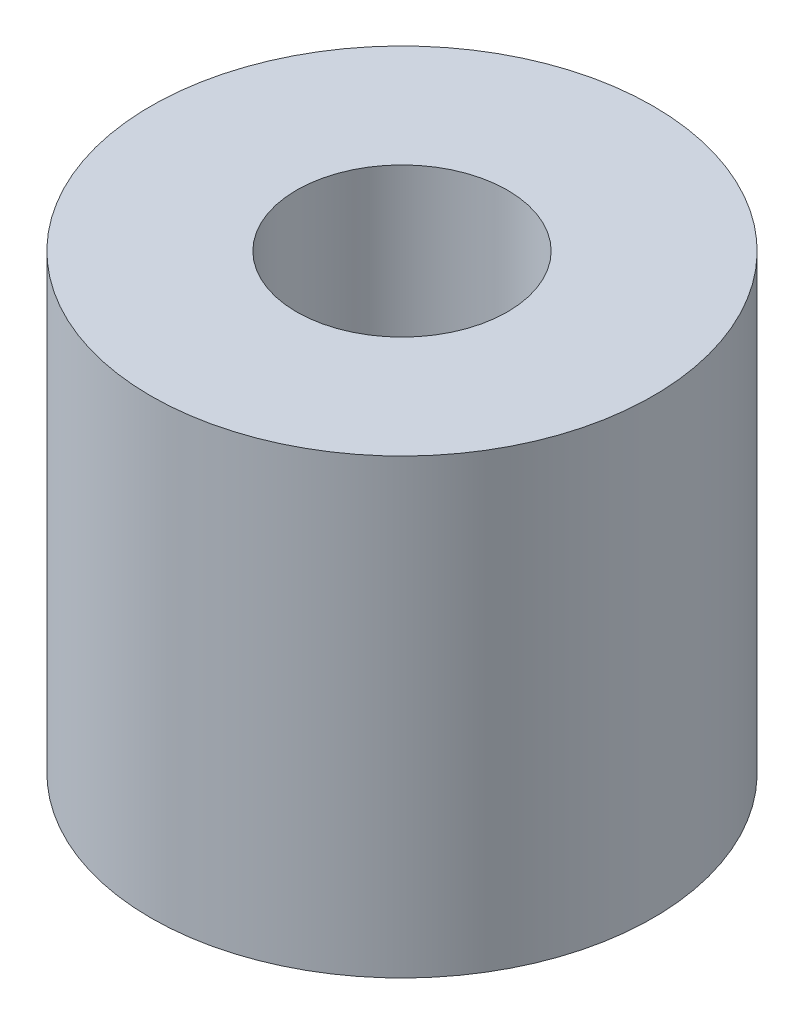
ISO-10303-21;
HEADER;
FILE_DESCRIPTION(('STEP AP214'),'2;1');
FILE_NAME('part.step','',(''),(''),'','','');
FILE_SCHEMA(('AUTOMOTIVE_DESIGN { 1 0 10303 214 1 1 1 1 }'));
ENDSEC;
DATA;
#1=APPLICATION_CONTEXT('core data for automotive mechanical design processes');
#2=APPLICATION_PROTOCOL_DEFINITION('international standard','automotive_design',2000,#1);
#3=PRODUCT_CONTEXT('',#1,'mechanical');
#4=PRODUCT('Part','Part','',(#3));
#5=PRODUCT_RELATED_PRODUCT_CATEGORY('part','',(#4));
#6=PRODUCT_DEFINITION_FORMATION('','',#4);
#7=PRODUCT_DEFINITION_CONTEXT('part definition',#1,'design');
#8=PRODUCT_DEFINITION('design','',#6,#7);
#9=PRODUCT_DEFINITION_SHAPE('','',#8);
#10=(LENGTH_UNIT() NAMED_UNIT(*) SI_UNIT(.MILLI.,.METRE.));
#11=(NAMED_UNIT(*) PLANE_ANGLE_UNIT() SI_UNIT($,.RADIAN.));
#12=(NAMED_UNIT(*) SI_UNIT($,.STERADIAN.) SOLID_ANGLE_UNIT());
#13=UNCERTAINTY_MEASURE_WITH_UNIT(LENGTH_MEASURE(1.E-05),#10,'distance_accuracy_value','');
#14=(GEOMETRIC_REPRESENTATION_CONTEXT(3) GLOBAL_UNCERTAINTY_ASSIGNED_CONTEXT((#13)) GLOBAL_UNIT_ASSIGNED_CONTEXT((#10,
#11,#12)) REPRESENTATION_CONTEXT('',''));
#15=CARTESIAN_POINT('',(0.,0.,0.));
#16=DIRECTION('',(0.,0.,1.));
#17=DIRECTION('',(1.,0.,0.));
#18=AXIS2_PLACEMENT_3D('',#15,#16,#17);
#19=CARTESIAN_POINT('',(0.,9.,0.));
#20=DIRECTION('',(0.,1.,0.));
#21=DIRECTION('',(0.,0.,1.));
#22=AXIS2_PLACEMENT_3D('',#19,#20,#21);
#23=PLANE('',#22);
#24=CARTESIAN_POINT('',(0.,9.,0.));
#25=DIRECTION('',(0.,1.,0.));
#26=DIRECTION('',(0.,0.,1.));
#27=AXIS2_PLACEMENT_3D('',#24,#25,#26);
#28=CIRCLE('',#27,5.);
#29=CARTESIAN_POINT('',(0.,9.,5.));
#30=VERTEX_POINT('',#29);
#31=EDGE_CURVE('E10',#30,#30,#28,.T.);
#32=ORIENTED_EDGE('',*,*,#31,.T.);
#33=EDGE_LOOP('',(#32));
#34=FACE_BOUND('',#33,.T.);
#35=CARTESIAN_POINT('',(0.,9.,0.));
#36=DIRECTION('',(0.,1.,0.));
#37=DIRECTION('',(0.,0.,1.));
#38=AXIS2_PLACEMENT_3D('',#35,#36,#37);
#39=CIRCLE('',#38,2.1);
#40=CARTESIAN_POINT('',(0.,9.,2.1));
#41=VERTEX_POINT('',#40);
#42=EDGE_CURVE('E50',#41,#41,#39,.T.);
#43=ORIENTED_EDGE('',*,*,#42,.F.);
#44=EDGE_LOOP('',(#43));
#45=FACE_BOUND('',#44,.T.);
#46=ADVANCED_FACE('F37',(#34,#45),#23,.T.);
#47=CARTESIAN_POINT('',(0.,0.,0.));
#48=DIRECTION('',(0.,1.,0.));
#49=DIRECTION('',(0.,0.,1.));
#50=AXIS2_PLACEMENT_3D('',#47,#48,#49);
#51=PLANE('',#50);
#52=CARTESIAN_POINT('',(0.,0.,0.));
#53=DIRECTION('',(0.,1.,0.));
#54=DIRECTION('',(0.,0.,1.));
#55=AXIS2_PLACEMENT_3D('',#52,#53,#54);
#56=CIRCLE('',#55,5.);
#57=CARTESIAN_POINT('',(0.,0.,5.));
#58=VERTEX_POINT('',#57);
#59=EDGE_CURVE('E41',#58,#58,#56,.T.);
#60=ORIENTED_EDGE('',*,*,#59,.F.);
#61=EDGE_LOOP('',(#60));
#62=FACE_BOUND('',#61,.T.);
#63=CARTESIAN_POINT('',(0.,0.,0.));
#64=DIRECTION('',(0.,1.,0.));
#65=DIRECTION('',(0.,0.,1.));
#66=AXIS2_PLACEMENT_3D('',#63,#64,#65);
#67=CIRCLE('',#66,2.1);
#68=CARTESIAN_POINT('',(0.,0.,2.1));
#69=VERTEX_POINT('',#68);
#70=EDGE_CURVE('E52',#69,#69,#67,.T.);
#71=ORIENTED_EDGE('',*,*,#70,.T.);
#72=EDGE_LOOP('',(#71));
#73=FACE_BOUND('',#72,.T.);
#74=ADVANCED_FACE('F64',(#62,#73),#51,.F.);
#75=CARTESIAN_POINT('',(0.,9.,0.));
#76=DIRECTION('',(0.,-1.,0.));
#77=DIRECTION('',(0.,0.,-1.));
#78=AXIS2_PLACEMENT_3D('',#75,#76,#77);
#79=CYLINDRICAL_SURFACE('',#78,5.);
#80=ORIENTED_EDGE('',*,*,#31,.F.);
#81=EDGE_LOOP('',(#80));
#82=FACE_BOUND('',#81,.T.);
#83=ORIENTED_EDGE('',*,*,#59,.T.);
#84=EDGE_LOOP('',(#83));
#85=FACE_BOUND('',#84,.T.);
#86=ADVANCED_FACE('F39',(#82,#85),#79,.T.);
#87=CARTESIAN_POINT('',(0.,9.,0.));
#88=DIRECTION('',(0.,-1.,0.));
#89=DIRECTION('',(0.,0.,-1.));
#90=AXIS2_PLACEMENT_3D('',#87,#88,#89);
#91=CYLINDRICAL_SURFACE('',#90,2.1);
#92=ORIENTED_EDGE('',*,*,#42,.T.);
#93=EDGE_LOOP('',(#92));
#94=FACE_BOUND('',#93,.T.);
#95=ORIENTED_EDGE('',*,*,#70,.F.);
#96=EDGE_LOOP('',(#95));
#97=FACE_BOUND('',#96,.T.);
#98=ADVANCED_FACE('F60',(#94,#97),#91,.F.);
#99=CLOSED_SHELL('',(#46,#74,#86,#98));
#100=MANIFOLD_SOLID_BREP('B2',#99);
#101=ADVANCED_BREP_SHAPE_REPRESENTATION('',(#18,#100),#14);
#102=SHAPE_DEFINITION_REPRESENTATION(#9,#101);
ENDSEC;
END-ISO-10303-21;
